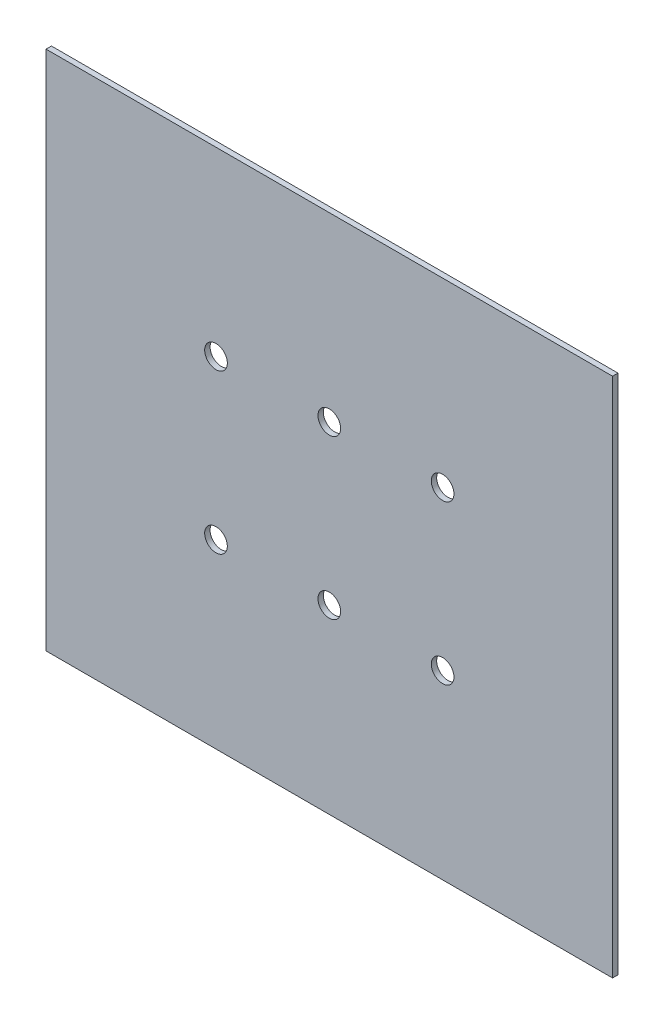
ISO-10303-21;
HEADER;
FILE_DESCRIPTION(('STEP AP214'),'2;1');
FILE_NAME('part.step','',(''),(''),'','','');
FILE_SCHEMA(('AUTOMOTIVE_DESIGN { 1 0 10303 214 1 1 1 1 }'));
ENDSEC;
DATA;
#1=APPLICATION_CONTEXT('core data for automotive mechanical design processes');
#2=APPLICATION_PROTOCOL_DEFINITION('international standard','automotive_design',2000,#1);
#3=PRODUCT_CONTEXT('',#1,'mechanical');
#4=PRODUCT('Part','Part','',(#3));
#5=PRODUCT_RELATED_PRODUCT_CATEGORY('part','',(#4));
#6=PRODUCT_DEFINITION_FORMATION('','',#4);
#7=PRODUCT_DEFINITION_CONTEXT('part definition',#1,'design');
#8=PRODUCT_DEFINITION('design','',#6,#7);
#9=PRODUCT_DEFINITION_SHAPE('','',#8);
#10=(LENGTH_UNIT() NAMED_UNIT(*) SI_UNIT(.MILLI.,.METRE.));
#11=(NAMED_UNIT(*) PLANE_ANGLE_UNIT() SI_UNIT($,.RADIAN.));
#12=(NAMED_UNIT(*) SI_UNIT($,.STERADIAN.) SOLID_ANGLE_UNIT());
#13=UNCERTAINTY_MEASURE_WITH_UNIT(LENGTH_MEASURE(1.E-05),#10,'distance_accuracy_value','');
#14=(GEOMETRIC_REPRESENTATION_CONTEXT(3) GLOBAL_UNCERTAINTY_ASSIGNED_CONTEXT((#13)) GLOBAL_UNIT_ASSIGNED_CONTEXT((#10,
#11,#12)) REPRESENTATION_CONTEXT('',''));
#15=CARTESIAN_POINT('',(0.,0.,0.));
#16=DIRECTION('',(0.,0.,1.));
#17=DIRECTION('',(1.,0.,0.));
#18=AXIS2_PLACEMENT_3D('',#15,#16,#17);
#19=CARTESIAN_POINT('',(0.,0.,4.7625));
#20=DIRECTION('',(0.,0.,1.));
#21=DIRECTION('',(1.,0.,0.));
#22=AXIS2_PLACEMENT_3D('',#19,#20,#21);
#23=PLANE('',#22);
#24=CARTESIAN_POINT('',(-100.,140.,4.7625));
#25=DIRECTION('',(0.,0.,1.));
#26=DIRECTION('',(1.,0.,0.));
#27=AXIS2_PLACEMENT_3D('',#24,#25,#26);
#28=CIRCLE('',#27,10.);
#29=CARTESIAN_POINT('',(-110.,140.,4.7625));
#30=VERTEX_POINT('',#29);
#31=EDGE_CURVE('E159',#30,#30,#28,.T.);
#32=ORIENTED_EDGE('',*,*,#31,.F.);
#33=EDGE_LOOP('',(#32));
#34=FACE_BOUND('',#33,.T.);
#35=CARTESIAN_POINT('',(-200.,0.,4.7625));
#36=DIRECTION('',(0.,0.,1.));
#37=DIRECTION('',(1.,0.,0.));
#38=AXIS2_PLACEMENT_3D('',#35,#36,#37);
#39=CIRCLE('',#38,10.);
#40=CARTESIAN_POINT('',(-210.,0.,4.7625));
#41=VERTEX_POINT('',#40);
#42=EDGE_CURVE('E143',#41,#41,#39,.T.);
#43=ORIENTED_EDGE('',*,*,#42,.F.);
#44=EDGE_LOOP('',(#43));
#45=FACE_BOUND('',#44,.T.);
#46=CARTESIAN_POINT('',(0.,0.,4.7625));
#47=DIRECTION('',(0.,0.,1.));
#48=DIRECTION('',(1.,0.,0.));
#49=AXIS2_PLACEMENT_3D('',#46,#47,#48);
#50=CIRCLE('',#49,10.);
#51=CARTESIAN_POINT('',(-10.,0.,4.7625));
#52=VERTEX_POINT('',#51);
#53=EDGE_CURVE('E111',#52,#52,#50,.T.);
#54=ORIENTED_EDGE('',*,*,#53,.F.);
#55=EDGE_LOOP('',(#54));
#56=FACE_BOUND('',#55,.T.);
#57=DIRECTION('',(0.,1.,0.));
#58=VECTOR('',#57,1.);
#59=CARTESIAN_POINT('',(150.,300.,4.7625));
#60=LINE('',#59,#58);
#61=CARTESIAN_POINT('',(150.,-160.,4.7625));
#62=VERTEX_POINT('',#61);
#63=CARTESIAN_POINT('',(150.,300.,4.7625));
#64=VERTEX_POINT('',#63);
#65=EDGE_CURVE('E90',#62,#64,#60,.T.);
#66=ORIENTED_EDGE('',*,*,#65,.T.);
#67=DIRECTION('',(-1.,0.,0.));
#68=VECTOR('',#67,1.);
#69=CARTESIAN_POINT('',(-350.,300.,4.7625));
#70=LINE('',#69,#68);
#71=CARTESIAN_POINT('',(-350.,300.,4.7625));
#72=VERTEX_POINT('',#71);
#73=EDGE_CURVE('E85',#64,#72,#70,.T.);
#74=ORIENTED_EDGE('',*,*,#73,.T.);
#75=DIRECTION('',(0.,-1.,0.));
#76=VECTOR('',#75,1.);
#77=CARTESIAN_POINT('',(-350.,300.,4.7625));
#78=LINE('',#77,#76);
#79=CARTESIAN_POINT('',(-350.,-160.,4.7625));
#80=VERTEX_POINT('',#79);
#81=EDGE_CURVE('E88',#72,#80,#78,.T.);
#82=ORIENTED_EDGE('',*,*,#81,.T.);
#83=DIRECTION('',(1.,0.,0.));
#84=VECTOR('',#83,1.);
#85=CARTESIAN_POINT('',(-350.,-160.,4.7625));
#86=LINE('',#85,#84);
#87=EDGE_CURVE('E55',#80,#62,#86,.T.);
#88=ORIENTED_EDGE('',*,*,#87,.T.);
#89=EDGE_LOOP('',(#66,#74,#82,#88));
#90=FACE_BOUND('',#89,.T.);
#91=CARTESIAN_POINT('',(-100.,0.,4.7625));
#92=DIRECTION('',(0.,0.,1.));
#93=DIRECTION('',(1.,0.,0.));
#94=AXIS2_PLACEMENT_3D('',#91,#92,#93);
#95=CIRCLE('',#94,9.99999999999999);
#96=CARTESIAN_POINT('',(-110.,0.,4.7625));
#97=VERTEX_POINT('',#96);
#98=EDGE_CURVE('E135',#97,#97,#95,.T.);
#99=ORIENTED_EDGE('',*,*,#98,.F.);
#100=EDGE_LOOP('',(#99));
#101=FACE_BOUND('',#100,.T.);
#102=CARTESIAN_POINT('',(-200.,140.,4.7625));
#103=DIRECTION('',(0.,0.,1.));
#104=DIRECTION('',(1.,0.,0.));
#105=AXIS2_PLACEMENT_3D('',#102,#103,#104);
#106=CIRCLE('',#105,10.);
#107=CARTESIAN_POINT('',(-210.,140.,4.7625));
#108=VERTEX_POINT('',#107);
#109=EDGE_CURVE('E151',#108,#108,#106,.T.);
#110=ORIENTED_EDGE('',*,*,#109,.F.);
#111=EDGE_LOOP('',(#110));
#112=FACE_BOUND('',#111,.T.);
#113=CARTESIAN_POINT('',(0.,140.,4.7625));
#114=DIRECTION('',(0.,0.,1.));
#115=DIRECTION('',(1.,0.,0.));
#116=AXIS2_PLACEMENT_3D('',#113,#114,#115);
#117=CIRCLE('',#116,10.);
#118=CARTESIAN_POINT('',(-10.,140.,4.7625));
#119=VERTEX_POINT('',#118);
#120=EDGE_CURVE('E167',#119,#119,#117,.T.);
#121=ORIENTED_EDGE('',*,*,#120,.F.);
#122=EDGE_LOOP('',(#121));
#123=FACE_BOUND('',#122,.T.);
#124=ADVANCED_FACE('F37',(#34,#45,#56,#90,#101,#112,#123),#23,.T.);
#125=CARTESIAN_POINT('',(0.,0.,0.));
#126=DIRECTION('',(0.,0.,1.));
#127=DIRECTION('',(1.,0.,0.));
#128=AXIS2_PLACEMENT_3D('',#125,#126,#127);
#129=PLANE('',#128);
#130=DIRECTION('',(0.,1.,0.));
#131=VECTOR('',#130,1.);
#132=CARTESIAN_POINT('',(150.,300.,0.));
#133=LINE('',#132,#131);
#134=CARTESIAN_POINT('',(150.,-160.,0.));
#135=VERTEX_POINT('',#134);
#136=CARTESIAN_POINT('',(150.,300.,0.));
#137=VERTEX_POINT('',#136);
#138=EDGE_CURVE('E107',#135,#137,#133,.T.);
#139=ORIENTED_EDGE('',*,*,#138,.F.);
#140=DIRECTION('',(1.,0.,0.));
#141=VECTOR('',#140,1.);
#142=CARTESIAN_POINT('',(-350.,-160.,0.));
#143=LINE('',#142,#141);
#144=CARTESIAN_POINT('',(-350.,-160.,0.));
#145=VERTEX_POINT('',#144);
#146=EDGE_CURVE('E78',#145,#135,#143,.T.);
#147=ORIENTED_EDGE('',*,*,#146,.F.);
#148=DIRECTION('',(0.,-1.,0.));
#149=VECTOR('',#148,1.);
#150=CARTESIAN_POINT('',(-350.,300.,0.));
#151=LINE('',#150,#149);
#152=CARTESIAN_POINT('',(-350.,300.,0.));
#153=VERTEX_POINT('',#152);
#154=EDGE_CURVE('E72',#153,#145,#151,.T.);
#155=ORIENTED_EDGE('',*,*,#154,.F.);
#156=DIRECTION('',(-1.,0.,0.));
#157=VECTOR('',#156,1.);
#158=CARTESIAN_POINT('',(-350.,300.,0.));
#159=LINE('',#158,#157);
#160=EDGE_CURVE('E95',#137,#153,#159,.T.);
#161=ORIENTED_EDGE('',*,*,#160,.F.);
#162=EDGE_LOOP('',(#139,#147,#155,#161));
#163=FACE_BOUND('',#162,.T.);
#164=CARTESIAN_POINT('',(0.,0.,0.));
#165=DIRECTION('',(0.,0.,1.));
#166=DIRECTION('',(1.,0.,0.));
#167=AXIS2_PLACEMENT_3D('',#164,#165,#166);
#168=CIRCLE('',#167,10.);
#169=CARTESIAN_POINT('',(-10.,0.,0.));
#170=VERTEX_POINT('',#169);
#171=EDGE_CURVE('E131',#170,#170,#168,.T.);
#172=ORIENTED_EDGE('',*,*,#171,.T.);
#173=EDGE_LOOP('',(#172));
#174=FACE_BOUND('',#173,.T.);
#175=CARTESIAN_POINT('',(-100.,0.,0.));
#176=DIRECTION('',(0.,0.,1.));
#177=DIRECTION('',(1.,0.,0.));
#178=AXIS2_PLACEMENT_3D('',#175,#176,#177);
#179=CIRCLE('',#178,9.99999999999999);
#180=CARTESIAN_POINT('',(-110.,0.,0.));
#181=VERTEX_POINT('',#180);
#182=EDGE_CURVE('E139',#181,#181,#179,.T.);
#183=ORIENTED_EDGE('',*,*,#182,.T.);
#184=EDGE_LOOP('',(#183));
#185=FACE_BOUND('',#184,.T.);
#186=CARTESIAN_POINT('',(-200.,0.,0.));
#187=DIRECTION('',(0.,0.,1.));
#188=DIRECTION('',(1.,0.,0.));
#189=AXIS2_PLACEMENT_3D('',#186,#187,#188);
#190=CIRCLE('',#189,10.);
#191=CARTESIAN_POINT('',(-210.,0.,0.));
#192=VERTEX_POINT('',#191);
#193=EDGE_CURVE('E147',#192,#192,#190,.T.);
#194=ORIENTED_EDGE('',*,*,#193,.T.);
#195=EDGE_LOOP('',(#194));
#196=FACE_BOUND('',#195,.T.);
#197=CARTESIAN_POINT('',(-200.,140.,0.));
#198=DIRECTION('',(0.,0.,1.));
#199=DIRECTION('',(1.,0.,0.));
#200=AXIS2_PLACEMENT_3D('',#197,#198,#199);
#201=CIRCLE('',#200,10.);
#202=CARTESIAN_POINT('',(-210.,140.,0.));
#203=VERTEX_POINT('',#202);
#204=EDGE_CURVE('E155',#203,#203,#201,.T.);
#205=ORIENTED_EDGE('',*,*,#204,.T.);
#206=EDGE_LOOP('',(#205));
#207=FACE_BOUND('',#206,.T.);
#208=CARTESIAN_POINT('',(-100.,140.,0.));
#209=DIRECTION('',(0.,0.,1.));
#210=DIRECTION('',(1.,0.,0.));
#211=AXIS2_PLACEMENT_3D('',#208,#209,#210);
#212=CIRCLE('',#211,10.);
#213=CARTESIAN_POINT('',(-110.,140.,0.));
#214=VERTEX_POINT('',#213);
#215=EDGE_CURVE('E163',#214,#214,#212,.T.);
#216=ORIENTED_EDGE('',*,*,#215,.T.);
#217=EDGE_LOOP('',(#216));
#218=FACE_BOUND('',#217,.T.);
#219=CARTESIAN_POINT('',(0.,140.,0.));
#220=DIRECTION('',(0.,0.,1.));
#221=DIRECTION('',(1.,0.,0.));
#222=AXIS2_PLACEMENT_3D('',#219,#220,#221);
#223=CIRCLE('',#222,10.);
#224=CARTESIAN_POINT('',(-10.,140.,0.));
#225=VERTEX_POINT('',#224);
#226=EDGE_CURVE('E171',#225,#225,#223,.T.);
#227=ORIENTED_EDGE('',*,*,#226,.T.);
#228=EDGE_LOOP('',(#227));
#229=FACE_BOUND('',#228,.T.);
#230=ADVANCED_FACE('F125',(#163,#174,#185,#196,#207,#218,#229),#129,.F.);
#231=CARTESIAN_POINT('',(150.,300.,4.7625));
#232=DIRECTION('',(-1.,0.,0.));
#233=DIRECTION('',(0.,-1.,0.));
#234=AXIS2_PLACEMENT_3D('',#231,#232,#233);
#235=PLANE('',#234);
#236=ORIENTED_EDGE('',*,*,#138,.T.);
#237=DIRECTION('',(0.,0.,-1.));
#238=VECTOR('',#237,1.);
#239=CARTESIAN_POINT('',(150.,300.,4.7625));
#240=LINE('',#239,#238);
#241=EDGE_CURVE('E11',#64,#137,#240,.T.);
#242=ORIENTED_EDGE('',*,*,#241,.F.);
#243=ORIENTED_EDGE('',*,*,#65,.F.);
#244=DIRECTION('',(0.,0.,-1.));
#245=VECTOR('',#244,1.);
#246=CARTESIAN_POINT('',(150.,-160.,4.7625));
#247=LINE('',#246,#245);
#248=EDGE_CURVE('E103',#62,#135,#247,.T.);
#249=ORIENTED_EDGE('',*,*,#248,.T.);
#250=EDGE_LOOP('',(#236,#242,#243,#249));
#251=FACE_BOUND('',#250,.T.);
#252=ADVANCED_FACE('F39',(#251),#235,.F.);
#253=CARTESIAN_POINT('',(-350.,300.,4.7625));
#254=DIRECTION('',(0.,-1.,0.));
#255=DIRECTION('',(0.,0.,-1.));
#256=AXIS2_PLACEMENT_3D('',#253,#254,#255);
#257=PLANE('',#256);
#258=ORIENTED_EDGE('',*,*,#160,.T.);
#259=DIRECTION('',(0.,0.,-1.));
#260=VECTOR('',#259,1.);
#261=CARTESIAN_POINT('',(-350.,300.,4.7625));
#262=LINE('',#261,#260);
#263=EDGE_CURVE('E47',#72,#153,#262,.T.);
#264=ORIENTED_EDGE('',*,*,#263,.F.);
#265=ORIENTED_EDGE('',*,*,#73,.F.);
#266=ORIENTED_EDGE('',*,*,#241,.T.);
#267=EDGE_LOOP('',(#258,#264,#265,#266));
#268=FACE_BOUND('',#267,.T.);
#269=ADVANCED_FACE('F94',(#268),#257,.F.);
#270=CARTESIAN_POINT('',(-350.,300.,4.7625));
#271=DIRECTION('',(1.,0.,0.));
#272=DIRECTION('',(0.,0.,-1.));
#273=AXIS2_PLACEMENT_3D('',#270,#271,#272);
#274=PLANE('',#273);
#275=ORIENTED_EDGE('',*,*,#154,.T.);
#276=DIRECTION('',(0.,0.,-1.));
#277=VECTOR('',#276,1.);
#278=CARTESIAN_POINT('',(-350.,-160.,4.7625));
#279=LINE('',#278,#277);
#280=EDGE_CURVE('E97',#80,#145,#279,.T.);
#281=ORIENTED_EDGE('',*,*,#280,.F.);
#282=ORIENTED_EDGE('',*,*,#81,.F.);
#283=ORIENTED_EDGE('',*,*,#263,.T.);
#284=EDGE_LOOP('',(#275,#281,#282,#283));
#285=FACE_BOUND('',#284,.T.);
#286=ADVANCED_FACE('F98',(#285),#274,.F.);
#287=CARTESIAN_POINT('',(-350.,-160.,4.7625));
#288=DIRECTION('',(0.,1.,0.));
#289=DIRECTION('',(0.,0.,1.));
#290=AXIS2_PLACEMENT_3D('',#287,#288,#289);
#291=PLANE('',#290);
#292=ORIENTED_EDGE('',*,*,#146,.T.);
#293=ORIENTED_EDGE('',*,*,#248,.F.);
#294=ORIENTED_EDGE('',*,*,#87,.F.);
#295=ORIENTED_EDGE('',*,*,#280,.T.);
#296=EDGE_LOOP('',(#292,#293,#294,#295));
#297=FACE_BOUND('',#296,.T.);
#298=ADVANCED_FACE('F122',(#297),#291,.F.);
#299=CARTESIAN_POINT('',(0.,0.,4.7625));
#300=DIRECTION('',(0.,0.,-1.));
#301=DIRECTION('',(-1.,0.,0.));
#302=AXIS2_PLACEMENT_3D('',#299,#300,#301);
#303=CYLINDRICAL_SURFACE('',#302,10.);
#304=CARTESIAN_POINT('',(-10.,0.,4.7625));
#305=CARTESIAN_POINT('',(-10.,0.,4.712890625));
#306=CARTESIAN_POINT('',(-10.,0.,4.66328125));
#307=CARTESIAN_POINT('',(-10.,0.,4.5640625));
#308=CARTESIAN_POINT('',(-10.,0.,4.514453125));
#309=CARTESIAN_POINT('',(-10.,0.,4.415234375));
#310=CARTESIAN_POINT('',(-10.,0.,4.365625));
#311=CARTESIAN_POINT('',(-10.,0.,4.26640625));
#312=CARTESIAN_POINT('',(-10.,0.,4.216796875));
#313=CARTESIAN_POINT('',(-10.,0.,4.117578125));
#314=CARTESIAN_POINT('',(-10.,0.,4.06796875));
#315=CARTESIAN_POINT('',(-10.,0.,3.96875));
#316=CARTESIAN_POINT('',(-10.,0.,3.919140625));
#317=CARTESIAN_POINT('',(-10.,0.,3.819921875));
#318=CARTESIAN_POINT('',(-10.,0.,3.7703125));
#319=CARTESIAN_POINT('',(-10.,0.,3.67109375));
#320=CARTESIAN_POINT('',(-10.,0.,3.621484375));
#321=CARTESIAN_POINT('',(-10.,0.,3.522265625));
#322=CARTESIAN_POINT('',(-10.,0.,3.47265625));
#323=CARTESIAN_POINT('',(-10.,0.,3.3734375));
#324=CARTESIAN_POINT('',(-10.,0.,3.323828125));
#325=CARTESIAN_POINT('',(-10.,0.,3.224609375));
#326=CARTESIAN_POINT('',(-10.,0.,3.175));
#327=CARTESIAN_POINT('',(-10.,0.,3.07578125));
#328=CARTESIAN_POINT('',(-10.,0.,3.026171875));
#329=CARTESIAN_POINT('',(-10.,0.,2.926953125));
#330=CARTESIAN_POINT('',(-10.,0.,2.87734375));
#331=CARTESIAN_POINT('',(-10.,0.,2.778125));
#332=CARTESIAN_POINT('',(-10.,0.,2.728515625));
#333=CARTESIAN_POINT('',(-10.,0.,2.629296875));
#334=CARTESIAN_POINT('',(-10.,0.,2.5796875));
#335=CARTESIAN_POINT('',(-10.,0.,2.48046875));
#336=CARTESIAN_POINT('',(-10.,0.,2.430859375));
#337=CARTESIAN_POINT('',(-10.,0.,2.331640625));
#338=CARTESIAN_POINT('',(-10.,0.,2.28203125));
#339=CARTESIAN_POINT('',(-10.,0.,2.1828125));
#340=CARTESIAN_POINT('',(-10.,0.,2.133203125));
#341=CARTESIAN_POINT('',(-10.,0.,2.033984375));
#342=CARTESIAN_POINT('',(-10.,0.,1.984375));
#343=CARTESIAN_POINT('',(-10.,0.,1.88515625));
#344=CARTESIAN_POINT('',(-10.,0.,1.835546875));
#345=CARTESIAN_POINT('',(-10.,0.,1.736328125));
#346=CARTESIAN_POINT('',(-10.,0.,1.68671875));
#347=CARTESIAN_POINT('',(-10.,0.,1.5875));
#348=CARTESIAN_POINT('',(-10.,0.,1.537890625));
#349=CARTESIAN_POINT('',(-10.,0.,1.438671875));
#350=CARTESIAN_POINT('',(-10.,0.,1.3890625));
#351=CARTESIAN_POINT('',(-10.,0.,1.28984375));
#352=CARTESIAN_POINT('',(-10.,0.,1.240234375));
#353=CARTESIAN_POINT('',(-10.,0.,1.141015625));
#354=CARTESIAN_POINT('',(-10.,0.,1.09140625));
#355=CARTESIAN_POINT('',(-10.,0.,0.9921875));
#356=CARTESIAN_POINT('',(-10.,0.,0.942578125));
#357=CARTESIAN_POINT('',(-10.,0.,0.843359375));
#358=CARTESIAN_POINT('',(-10.,0.,0.79375));
#359=CARTESIAN_POINT('',(-10.,0.,0.69453125));
#360=CARTESIAN_POINT('',(-10.,0.,0.644921875));
#361=CARTESIAN_POINT('',(-10.,0.,0.545703125));
#362=CARTESIAN_POINT('',(-10.,0.,0.49609375));
#363=CARTESIAN_POINT('',(-10.,0.,0.396875));
#364=CARTESIAN_POINT('',(-10.,0.,0.347265625));
#365=CARTESIAN_POINT('',(-10.,0.,0.248046875));
#366=CARTESIAN_POINT('',(-10.,0.,0.1984375));
#367=CARTESIAN_POINT('',(-10.,0.,0.09921875));
#368=CARTESIAN_POINT('',(-10.,0.,0.049609375));
#369=CARTESIAN_POINT('',(-10.,0.,0.));
#370=B_SPLINE_CURVE_WITH_KNOTS('',3,(#304,#305,#306,#307,#308,#309,#310,#311,#312,#313,#314,
#315,#316,#317,#318,#319,#320,#321,#322,#323,#324,#325,#326,#327,#328,#329,#330,#331,#332,#333,
#334,#335,#336,#337,#338,#339,#340,#341,#342,#343,#344,#345,#346,#347,#348,#349,#350,#351,#352,
#353,#354,#355,#356,#357,#358,#359,#360,#361,#362,#363,#364,#365,#366,#367,#368,#369),
.UNSPECIFIED.,.F.,.F.,(4,2,2,2,2,2,2,2,2,2,2,2,2,2,2,2,2,2,2,2,2,2,2,2,2,2,2,2,2,2,2,2,4),(0.,
0.148828124999999,0.297656249999999,0.446484374999999,0.595312499999999,0.744140625,0.89296875,
1.041796875,1.190625,1.339453125,1.48828125,1.637109375,1.7859375,1.934765625,2.08359375,
2.232421875,2.38125,2.530078125,2.67890625,2.827734375,2.9765625,3.125390625,3.27421875,
3.423046875,3.571875,3.720703125,3.86953125,4.018359375,4.1671875,4.316015625,4.46484375,
4.613671875,4.7625),.UNSPECIFIED.);
#371=EDGE_CURVE('BSEAM193',#52,#170,#370,.T.);
#372=ORIENTED_EDGE('',*,*,#53,.T.);
#373=ORIENTED_EDGE('',*,*,#171,.F.);
#374=ORIENTED_EDGE('',*,*,#371,.T.);
#375=ORIENTED_EDGE('',*,*,#371,.F.);
#376=EDGE_LOOP('',(#372,#374,#373,#375));
#377=FACE_BOUND('',#376,.T.);
#378=ADVANCED_FACE('F193',(#377),#303,.F.);
#379=CARTESIAN_POINT('',(-100.,0.,4.7625));
#380=DIRECTION('',(0.,0.,-1.));
#381=DIRECTION('',(-1.,0.,0.));
#382=AXIS2_PLACEMENT_3D('',#379,#380,#381);
#383=CYLINDRICAL_SURFACE('',#382,9.99999999999999);
#384=CARTESIAN_POINT('',(-110.,0.,4.7625));
#385=CARTESIAN_POINT('',(-110.,0.,4.712890625));
#386=CARTESIAN_POINT('',(-110.,0.,4.66328125));
#387=CARTESIAN_POINT('',(-110.,0.,4.5640625));
#388=CARTESIAN_POINT('',(-110.,0.,4.514453125));
#389=CARTESIAN_POINT('',(-110.,0.,4.415234375));
#390=CARTESIAN_POINT('',(-110.,0.,4.365625));
#391=CARTESIAN_POINT('',(-110.,0.,4.26640625));
#392=CARTESIAN_POINT('',(-110.,0.,4.216796875));
#393=CARTESIAN_POINT('',(-110.,0.,4.117578125));
#394=CARTESIAN_POINT('',(-110.,0.,4.06796875));
#395=CARTESIAN_POINT('',(-110.,0.,3.96875));
#396=CARTESIAN_POINT('',(-110.,0.,3.919140625));
#397=CARTESIAN_POINT('',(-110.,0.,3.819921875));
#398=CARTESIAN_POINT('',(-110.,0.,3.7703125));
#399=CARTESIAN_POINT('',(-110.,0.,3.67109375));
#400=CARTESIAN_POINT('',(-110.,0.,3.621484375));
#401=CARTESIAN_POINT('',(-110.,0.,3.522265625));
#402=CARTESIAN_POINT('',(-110.,0.,3.47265625));
#403=CARTESIAN_POINT('',(-110.,0.,3.3734375));
#404=CARTESIAN_POINT('',(-110.,0.,3.323828125));
#405=CARTESIAN_POINT('',(-110.,0.,3.224609375));
#406=CARTESIAN_POINT('',(-110.,0.,3.175));
#407=CARTESIAN_POINT('',(-110.,0.,3.07578125));
#408=CARTESIAN_POINT('',(-110.,0.,3.026171875));
#409=CARTESIAN_POINT('',(-110.,0.,2.926953125));
#410=CARTESIAN_POINT('',(-110.,0.,2.87734375));
#411=CARTESIAN_POINT('',(-110.,0.,2.778125));
#412=CARTESIAN_POINT('',(-110.,0.,2.728515625));
#413=CARTESIAN_POINT('',(-110.,0.,2.629296875));
#414=CARTESIAN_POINT('',(-110.,0.,2.5796875));
#415=CARTESIAN_POINT('',(-110.,0.,2.48046875));
#416=CARTESIAN_POINT('',(-110.,0.,2.430859375));
#417=CARTESIAN_POINT('',(-110.,0.,2.331640625));
#418=CARTESIAN_POINT('',(-110.,0.,2.28203125));
#419=CARTESIAN_POINT('',(-110.,0.,2.1828125));
#420=CARTESIAN_POINT('',(-110.,0.,2.133203125));
#421=CARTESIAN_POINT('',(-110.,0.,2.033984375));
#422=CARTESIAN_POINT('',(-110.,0.,1.984375));
#423=CARTESIAN_POINT('',(-110.,0.,1.88515625));
#424=CARTESIAN_POINT('',(-110.,0.,1.835546875));
#425=CARTESIAN_POINT('',(-110.,0.,1.736328125));
#426=CARTESIAN_POINT('',(-110.,0.,1.68671875));
#427=CARTESIAN_POINT('',(-110.,0.,1.5875));
#428=CARTESIAN_POINT('',(-110.,0.,1.537890625));
#429=CARTESIAN_POINT('',(-110.,0.,1.438671875));
#430=CARTESIAN_POINT('',(-110.,0.,1.3890625));
#431=CARTESIAN_POINT('',(-110.,0.,1.28984375));
#432=CARTESIAN_POINT('',(-110.,0.,1.240234375));
#433=CARTESIAN_POINT('',(-110.,0.,1.141015625));
#434=CARTESIAN_POINT('',(-110.,0.,1.09140625));
#435=CARTESIAN_POINT('',(-110.,0.,0.9921875));
#436=CARTESIAN_POINT('',(-110.,0.,0.942578125));
#437=CARTESIAN_POINT('',(-110.,0.,0.843359375));
#438=CARTESIAN_POINT('',(-110.,0.,0.79375));
#439=CARTESIAN_POINT('',(-110.,0.,0.69453125));
#440=CARTESIAN_POINT('',(-110.,0.,0.644921875));
#441=CARTESIAN_POINT('',(-110.,0.,0.545703125));
#442=CARTESIAN_POINT('',(-110.,0.,0.49609375));
#443=CARTESIAN_POINT('',(-110.,0.,0.396875));
#444=CARTESIAN_POINT('',(-110.,0.,0.347265625));
#445=CARTESIAN_POINT('',(-110.,0.,0.248046875));
#446=CARTESIAN_POINT('',(-110.,0.,0.1984375));
#447=CARTESIAN_POINT('',(-110.,0.,0.09921875));
#448=CARTESIAN_POINT('',(-110.,0.,0.049609375));
#449=CARTESIAN_POINT('',(-110.,0.,0.));
#450=B_SPLINE_CURVE_WITH_KNOTS('',3,(#384,#385,#386,#387,#388,#389,#390,#391,#392,#393,#394,
#395,#396,#397,#398,#399,#400,#401,#402,#403,#404,#405,#406,#407,#408,#409,#410,#411,#412,#413,
#414,#415,#416,#417,#418,#419,#420,#421,#422,#423,#424,#425,#426,#427,#428,#429,#430,#431,#432,
#433,#434,#435,#436,#437,#438,#439,#440,#441,#442,#443,#444,#445,#446,#447,#448,#449),
.UNSPECIFIED.,.F.,.F.,(4,2,2,2,2,2,2,2,2,2,2,2,2,2,2,2,2,2,2,2,2,2,2,2,2,2,2,2,2,2,2,2,4),(0.,
0.148828124999999,0.297656249999999,0.446484374999999,0.595312499999999,0.744140625,0.89296875,
1.041796875,1.190625,1.339453125,1.48828125,1.637109375,1.7859375,1.934765625,2.08359375,
2.232421875,2.38125,2.530078125,2.67890625,2.827734375,2.9765625,3.125390625,3.27421875,
3.423046875,3.571875,3.720703125,3.86953125,4.018359375,4.1671875,4.316015625,4.46484375,
4.613671875,4.7625),.UNSPECIFIED.);
#451=EDGE_CURVE('BSEAM248',#97,#181,#450,.T.);
#452=ORIENTED_EDGE('',*,*,#98,.T.);
#453=ORIENTED_EDGE('',*,*,#182,.F.);
#454=ORIENTED_EDGE('',*,*,#451,.T.);
#455=ORIENTED_EDGE('',*,*,#451,.F.);
#456=EDGE_LOOP('',(#452,#454,#453,#455));
#457=FACE_BOUND('',#456,.T.);
#458=ADVANCED_FACE('F248',(#457),#383,.F.);
#459=CARTESIAN_POINT('',(-200.,0.,4.7625));
#460=DIRECTION('',(0.,0.,-1.));
#461=DIRECTION('',(-1.,0.,0.));
#462=AXIS2_PLACEMENT_3D('',#459,#460,#461);
#463=CYLINDRICAL_SURFACE('',#462,10.);
#464=CARTESIAN_POINT('',(-210.,0.,4.7625));
#465=CARTESIAN_POINT('',(-210.,0.,4.712890625));
#466=CARTESIAN_POINT('',(-210.,0.,4.66328125));
#467=CARTESIAN_POINT('',(-210.,0.,4.5640625));
#468=CARTESIAN_POINT('',(-210.,0.,4.514453125));
#469=CARTESIAN_POINT('',(-210.,0.,4.415234375));
#470=CARTESIAN_POINT('',(-210.,0.,4.365625));
#471=CARTESIAN_POINT('',(-210.,0.,4.26640625));
#472=CARTESIAN_POINT('',(-210.,0.,4.216796875));
#473=CARTESIAN_POINT('',(-210.,0.,4.117578125));
#474=CARTESIAN_POINT('',(-210.,0.,4.06796875));
#475=CARTESIAN_POINT('',(-210.,0.,3.96875));
#476=CARTESIAN_POINT('',(-210.,0.,3.919140625));
#477=CARTESIAN_POINT('',(-210.,0.,3.819921875));
#478=CARTESIAN_POINT('',(-210.,0.,3.7703125));
#479=CARTESIAN_POINT('',(-210.,0.,3.67109375));
#480=CARTESIAN_POINT('',(-210.,0.,3.621484375));
#481=CARTESIAN_POINT('',(-210.,0.,3.522265625));
#482=CARTESIAN_POINT('',(-210.,0.,3.47265625));
#483=CARTESIAN_POINT('',(-210.,0.,3.3734375));
#484=CARTESIAN_POINT('',(-210.,0.,3.323828125));
#485=CARTESIAN_POINT('',(-210.,0.,3.224609375));
#486=CARTESIAN_POINT('',(-210.,0.,3.175));
#487=CARTESIAN_POINT('',(-210.,0.,3.07578125));
#488=CARTESIAN_POINT('',(-210.,0.,3.026171875));
#489=CARTESIAN_POINT('',(-210.,0.,2.926953125));
#490=CARTESIAN_POINT('',(-210.,0.,2.87734375));
#491=CARTESIAN_POINT('',(-210.,0.,2.778125));
#492=CARTESIAN_POINT('',(-210.,0.,2.728515625));
#493=CARTESIAN_POINT('',(-210.,0.,2.629296875));
#494=CARTESIAN_POINT('',(-210.,0.,2.5796875));
#495=CARTESIAN_POINT('',(-210.,0.,2.48046875));
#496=CARTESIAN_POINT('',(-210.,0.,2.430859375));
#497=CARTESIAN_POINT('',(-210.,0.,2.331640625));
#498=CARTESIAN_POINT('',(-210.,0.,2.28203125));
#499=CARTESIAN_POINT('',(-210.,0.,2.1828125));
#500=CARTESIAN_POINT('',(-210.,0.,2.133203125));
#501=CARTESIAN_POINT('',(-210.,0.,2.033984375));
#502=CARTESIAN_POINT('',(-210.,0.,1.984375));
#503=CARTESIAN_POINT('',(-210.,0.,1.88515625));
#504=CARTESIAN_POINT('',(-210.,0.,1.835546875));
#505=CARTESIAN_POINT('',(-210.,0.,1.736328125));
#506=CARTESIAN_POINT('',(-210.,0.,1.68671875));
#507=CARTESIAN_POINT('',(-210.,0.,1.5875));
#508=CARTESIAN_POINT('',(-210.,0.,1.537890625));
#509=CARTESIAN_POINT('',(-210.,0.,1.438671875));
#510=CARTESIAN_POINT('',(-210.,0.,1.3890625));
#511=CARTESIAN_POINT('',(-210.,0.,1.28984375));
#512=CARTESIAN_POINT('',(-210.,0.,1.240234375));
#513=CARTESIAN_POINT('',(-210.,0.,1.141015625));
#514=CARTESIAN_POINT('',(-210.,0.,1.09140625));
#515=CARTESIAN_POINT('',(-210.,0.,0.9921875));
#516=CARTESIAN_POINT('',(-210.,0.,0.942578125));
#517=CARTESIAN_POINT('',(-210.,0.,0.843359375));
#518=CARTESIAN_POINT('',(-210.,0.,0.79375));
#519=CARTESIAN_POINT('',(-210.,0.,0.69453125));
#520=CARTESIAN_POINT('',(-210.,0.,0.644921875));
#521=CARTESIAN_POINT('',(-210.,0.,0.545703125));
#522=CARTESIAN_POINT('',(-210.,0.,0.49609375));
#523=CARTESIAN_POINT('',(-210.,0.,0.396875));
#524=CARTESIAN_POINT('',(-210.,0.,0.347265625));
#525=CARTESIAN_POINT('',(-210.,0.,0.248046875));
#526=CARTESIAN_POINT('',(-210.,0.,0.1984375));
#527=CARTESIAN_POINT('',(-210.,0.,0.09921875));
#528=CARTESIAN_POINT('',(-210.,0.,0.049609375));
#529=CARTESIAN_POINT('',(-210.,0.,0.));
#530=B_SPLINE_CURVE_WITH_KNOTS('',3,(#464,#465,#466,#467,#468,#469,#470,#471,#472,#473,#474,
#475,#476,#477,#478,#479,#480,#481,#482,#483,#484,#485,#486,#487,#488,#489,#490,#491,#492,#493,
#494,#495,#496,#497,#498,#499,#500,#501,#502,#503,#504,#505,#506,#507,#508,#509,#510,#511,#512,
#513,#514,#515,#516,#517,#518,#519,#520,#521,#522,#523,#524,#525,#526,#527,#528,#529),
.UNSPECIFIED.,.F.,.F.,(4,2,2,2,2,2,2,2,2,2,2,2,2,2,2,2,2,2,2,2,2,2,2,2,2,2,2,2,2,2,2,2,4),(0.,
0.148828124999999,0.297656249999999,0.446484374999999,0.595312499999999,0.744140625,0.89296875,
1.041796875,1.190625,1.339453125,1.48828125,1.637109375,1.7859375,1.934765625,2.08359375,
2.232421875,2.38125,2.530078125,2.67890625,2.827734375,2.9765625,3.125390625,3.27421875,
3.423046875,3.571875,3.720703125,3.86953125,4.018359375,4.1671875,4.316015625,4.46484375,
4.613671875,4.7625),.UNSPECIFIED.);
#531=EDGE_CURVE('BSEAM257',#41,#192,#530,.T.);
#532=ORIENTED_EDGE('',*,*,#42,.T.);
#533=ORIENTED_EDGE('',*,*,#193,.F.);
#534=ORIENTED_EDGE('',*,*,#531,.T.);
#535=ORIENTED_EDGE('',*,*,#531,.F.);
#536=EDGE_LOOP('',(#532,#534,#533,#535));
#537=FACE_BOUND('',#536,.T.);
#538=ADVANCED_FACE('F257',(#537),#463,.F.);
#539=CARTESIAN_POINT('',(-200.,140.,4.7625));
#540=DIRECTION('',(0.,0.,-1.));
#541=DIRECTION('',(-1.,0.,0.));
#542=AXIS2_PLACEMENT_3D('',#539,#540,#541);
#543=CYLINDRICAL_SURFACE('',#542,10.);
#544=CARTESIAN_POINT('',(-210.,140.,4.7625));
#545=CARTESIAN_POINT('',(-210.,140.,4.712890625));
#546=CARTESIAN_POINT('',(-210.,140.,4.66328125));
#547=CARTESIAN_POINT('',(-210.,140.,4.5640625));
#548=CARTESIAN_POINT('',(-210.,140.,4.514453125));
#549=CARTESIAN_POINT('',(-210.,140.,4.415234375));
#550=CARTESIAN_POINT('',(-210.,140.,4.365625));
#551=CARTESIAN_POINT('',(-210.,140.,4.26640625));
#552=CARTESIAN_POINT('',(-210.,140.,4.216796875));
#553=CARTESIAN_POINT('',(-210.,140.,4.117578125));
#554=CARTESIAN_POINT('',(-210.,140.,4.06796875));
#555=CARTESIAN_POINT('',(-210.,140.,3.96875));
#556=CARTESIAN_POINT('',(-210.,140.,3.919140625));
#557=CARTESIAN_POINT('',(-210.,140.,3.819921875));
#558=CARTESIAN_POINT('',(-210.,140.,3.7703125));
#559=CARTESIAN_POINT('',(-210.,140.,3.67109375));
#560=CARTESIAN_POINT('',(-210.,140.,3.621484375));
#561=CARTESIAN_POINT('',(-210.,140.,3.522265625));
#562=CARTESIAN_POINT('',(-210.,140.,3.47265625));
#563=CARTESIAN_POINT('',(-210.,140.,3.3734375));
#564=CARTESIAN_POINT('',(-210.,140.,3.323828125));
#565=CARTESIAN_POINT('',(-210.,140.,3.224609375));
#566=CARTESIAN_POINT('',(-210.,140.,3.175));
#567=CARTESIAN_POINT('',(-210.,140.,3.07578125));
#568=CARTESIAN_POINT('',(-210.,140.,3.026171875));
#569=CARTESIAN_POINT('',(-210.,140.,2.926953125));
#570=CARTESIAN_POINT('',(-210.,140.,2.87734375));
#571=CARTESIAN_POINT('',(-210.,140.,2.778125));
#572=CARTESIAN_POINT('',(-210.,140.,2.728515625));
#573=CARTESIAN_POINT('',(-210.,140.,2.629296875));
#574=CARTESIAN_POINT('',(-210.,140.,2.5796875));
#575=CARTESIAN_POINT('',(-210.,140.,2.48046875));
#576=CARTESIAN_POINT('',(-210.,140.,2.430859375));
#577=CARTESIAN_POINT('',(-210.,140.,2.331640625));
#578=CARTESIAN_POINT('',(-210.,140.,2.28203125));
#579=CARTESIAN_POINT('',(-210.,140.,2.1828125));
#580=CARTESIAN_POINT('',(-210.,140.,2.133203125));
#581=CARTESIAN_POINT('',(-210.,140.,2.033984375));
#582=CARTESIAN_POINT('',(-210.,140.,1.984375));
#583=CARTESIAN_POINT('',(-210.,140.,1.88515625));
#584=CARTESIAN_POINT('',(-210.,140.,1.835546875));
#585=CARTESIAN_POINT('',(-210.,140.,1.736328125));
#586=CARTESIAN_POINT('',(-210.,140.,1.68671875));
#587=CARTESIAN_POINT('',(-210.,140.,1.5875));
#588=CARTESIAN_POINT('',(-210.,140.,1.537890625));
#589=CARTESIAN_POINT('',(-210.,140.,1.438671875));
#590=CARTESIAN_POINT('',(-210.,140.,1.3890625));
#591=CARTESIAN_POINT('',(-210.,140.,1.28984375));
#592=CARTESIAN_POINT('',(-210.,140.,1.240234375));
#593=CARTESIAN_POINT('',(-210.,140.,1.141015625));
#594=CARTESIAN_POINT('',(-210.,140.,1.09140625));
#595=CARTESIAN_POINT('',(-210.,140.,0.9921875));
#596=CARTESIAN_POINT('',(-210.,140.,0.942578125));
#597=CARTESIAN_POINT('',(-210.,140.,0.843359375));
#598=CARTESIAN_POINT('',(-210.,140.,0.79375));
#599=CARTESIAN_POINT('',(-210.,140.,0.69453125));
#600=CARTESIAN_POINT('',(-210.,140.,0.644921875));
#601=CARTESIAN_POINT('',(-210.,140.,0.545703125));
#602=CARTESIAN_POINT('',(-210.,140.,0.49609375));
#603=CARTESIAN_POINT('',(-210.,140.,0.396875));
#604=CARTESIAN_POINT('',(-210.,140.,0.347265625));
#605=CARTESIAN_POINT('',(-210.,140.,0.248046875));
#606=CARTESIAN_POINT('',(-210.,140.,0.1984375));
#607=CARTESIAN_POINT('',(-210.,140.,0.09921875));
#608=CARTESIAN_POINT('',(-210.,140.,0.049609375));
#609=CARTESIAN_POINT('',(-210.,140.,0.));
#610=B_SPLINE_CURVE_WITH_KNOTS('',3,(#544,#545,#546,#547,#548,#549,#550,#551,#552,#553,#554,
#555,#556,#557,#558,#559,#560,#561,#562,#563,#564,#565,#566,#567,#568,#569,#570,#571,#572,#573,
#574,#575,#576,#577,#578,#579,#580,#581,#582,#583,#584,#585,#586,#587,#588,#589,#590,#591,#592,
#593,#594,#595,#596,#597,#598,#599,#600,#601,#602,#603,#604,#605,#606,#607,#608,#609),
.UNSPECIFIED.,.F.,.F.,(4,2,2,2,2,2,2,2,2,2,2,2,2,2,2,2,2,2,2,2,2,2,2,2,2,2,2,2,2,2,2,2,4),(0.,
0.148828124999999,0.297656249999999,0.446484374999999,0.595312499999999,0.744140625,0.89296875,
1.041796875,1.190625,1.339453125,1.48828125,1.637109375,1.7859375,1.934765625,2.08359375,
2.232421875,2.38125,2.530078125,2.67890625,2.827734375,2.9765625,3.125390625,3.27421875,
3.423046875,3.571875,3.720703125,3.86953125,4.018359375,4.1671875,4.316015625,4.46484375,
4.613671875,4.7625),.UNSPECIFIED.);
#611=EDGE_CURVE('BSEAM266',#108,#203,#610,.T.);
#612=ORIENTED_EDGE('',*,*,#109,.T.);
#613=ORIENTED_EDGE('',*,*,#204,.F.);
#614=ORIENTED_EDGE('',*,*,#611,.T.);
#615=ORIENTED_EDGE('',*,*,#611,.F.);
#616=EDGE_LOOP('',(#612,#614,#613,#615));
#617=FACE_BOUND('',#616,.T.);
#618=ADVANCED_FACE('F266',(#617),#543,.F.);
#619=CARTESIAN_POINT('',(-100.,140.,4.7625));
#620=DIRECTION('',(0.,0.,-1.));
#621=DIRECTION('',(-1.,0.,0.));
#622=AXIS2_PLACEMENT_3D('',#619,#620,#621);
#623=CYLINDRICAL_SURFACE('',#622,10.);
#624=CARTESIAN_POINT('',(-110.,140.,4.7625));
#625=CARTESIAN_POINT('',(-110.,140.,4.712890625));
#626=CARTESIAN_POINT('',(-110.,140.,4.66328125));
#627=CARTESIAN_POINT('',(-110.,140.,4.5640625));
#628=CARTESIAN_POINT('',(-110.,140.,4.514453125));
#629=CARTESIAN_POINT('',(-110.,140.,4.415234375));
#630=CARTESIAN_POINT('',(-110.,140.,4.365625));
#631=CARTESIAN_POINT('',(-110.,140.,4.26640625));
#632=CARTESIAN_POINT('',(-110.,140.,4.216796875));
#633=CARTESIAN_POINT('',(-110.,140.,4.117578125));
#634=CARTESIAN_POINT('',(-110.,140.,4.06796875));
#635=CARTESIAN_POINT('',(-110.,140.,3.96875));
#636=CARTESIAN_POINT('',(-110.,140.,3.919140625));
#637=CARTESIAN_POINT('',(-110.,140.,3.819921875));
#638=CARTESIAN_POINT('',(-110.,140.,3.7703125));
#639=CARTESIAN_POINT('',(-110.,140.,3.67109375));
#640=CARTESIAN_POINT('',(-110.,140.,3.621484375));
#641=CARTESIAN_POINT('',(-110.,140.,3.522265625));
#642=CARTESIAN_POINT('',(-110.,140.,3.47265625));
#643=CARTESIAN_POINT('',(-110.,140.,3.3734375));
#644=CARTESIAN_POINT('',(-110.,140.,3.323828125));
#645=CARTESIAN_POINT('',(-110.,140.,3.224609375));
#646=CARTESIAN_POINT('',(-110.,140.,3.175));
#647=CARTESIAN_POINT('',(-110.,140.,3.07578125));
#648=CARTESIAN_POINT('',(-110.,140.,3.026171875));
#649=CARTESIAN_POINT('',(-110.,140.,2.926953125));
#650=CARTESIAN_POINT('',(-110.,140.,2.87734375));
#651=CARTESIAN_POINT('',(-110.,140.,2.778125));
#652=CARTESIAN_POINT('',(-110.,140.,2.728515625));
#653=CARTESIAN_POINT('',(-110.,140.,2.629296875));
#654=CARTESIAN_POINT('',(-110.,140.,2.5796875));
#655=CARTESIAN_POINT('',(-110.,140.,2.48046875));
#656=CARTESIAN_POINT('',(-110.,140.,2.430859375));
#657=CARTESIAN_POINT('',(-110.,140.,2.331640625));
#658=CARTESIAN_POINT('',(-110.,140.,2.28203125));
#659=CARTESIAN_POINT('',(-110.,140.,2.1828125));
#660=CARTESIAN_POINT('',(-110.,140.,2.133203125));
#661=CARTESIAN_POINT('',(-110.,140.,2.033984375));
#662=CARTESIAN_POINT('',(-110.,140.,1.984375));
#663=CARTESIAN_POINT('',(-110.,140.,1.88515625));
#664=CARTESIAN_POINT('',(-110.,140.,1.835546875));
#665=CARTESIAN_POINT('',(-110.,140.,1.736328125));
#666=CARTESIAN_POINT('',(-110.,140.,1.68671875));
#667=CARTESIAN_POINT('',(-110.,140.,1.5875));
#668=CARTESIAN_POINT('',(-110.,140.,1.537890625));
#669=CARTESIAN_POINT('',(-110.,140.,1.438671875));
#670=CARTESIAN_POINT('',(-110.,140.,1.3890625));
#671=CARTESIAN_POINT('',(-110.,140.,1.28984375));
#672=CARTESIAN_POINT('',(-110.,140.,1.240234375));
#673=CARTESIAN_POINT('',(-110.,140.,1.141015625));
#674=CARTESIAN_POINT('',(-110.,140.,1.09140625));
#675=CARTESIAN_POINT('',(-110.,140.,0.9921875));
#676=CARTESIAN_POINT('',(-110.,140.,0.942578125));
#677=CARTESIAN_POINT('',(-110.,140.,0.843359375));
#678=CARTESIAN_POINT('',(-110.,140.,0.79375));
#679=CARTESIAN_POINT('',(-110.,140.,0.69453125));
#680=CARTESIAN_POINT('',(-110.,140.,0.644921875));
#681=CARTESIAN_POINT('',(-110.,140.,0.545703125));
#682=CARTESIAN_POINT('',(-110.,140.,0.49609375));
#683=CARTESIAN_POINT('',(-110.,140.,0.396875));
#684=CARTESIAN_POINT('',(-110.,140.,0.347265625));
#685=CARTESIAN_POINT('',(-110.,140.,0.248046875));
#686=CARTESIAN_POINT('',(-110.,140.,0.1984375));
#687=CARTESIAN_POINT('',(-110.,140.,0.09921875));
#688=CARTESIAN_POINT('',(-110.,140.,0.049609375));
#689=CARTESIAN_POINT('',(-110.,140.,0.));
#690=B_SPLINE_CURVE_WITH_KNOTS('',3,(#624,#625,#626,#627,#628,#629,#630,#631,#632,#633,#634,
#635,#636,#637,#638,#639,#640,#641,#642,#643,#644,#645,#646,#647,#648,#649,#650,#651,#652,#653,
#654,#655,#656,#657,#658,#659,#660,#661,#662,#663,#664,#665,#666,#667,#668,#669,#670,#671,#672,
#673,#674,#675,#676,#677,#678,#679,#680,#681,#682,#683,#684,#685,#686,#687,#688,#689),
.UNSPECIFIED.,.F.,.F.,(4,2,2,2,2,2,2,2,2,2,2,2,2,2,2,2,2,2,2,2,2,2,2,2,2,2,2,2,2,2,2,2,4),(0.,
0.148828124999999,0.297656249999999,0.446484374999999,0.595312499999999,0.744140625,0.89296875,
1.041796875,1.190625,1.339453125,1.48828125,1.637109375,1.7859375,1.934765625,2.08359375,
2.232421875,2.38125,2.530078125,2.67890625,2.827734375,2.9765625,3.125390625,3.27421875,
3.423046875,3.571875,3.720703125,3.86953125,4.018359375,4.1671875,4.316015625,4.46484375,
4.613671875,4.7625),.UNSPECIFIED.);
#691=EDGE_CURVE('BSEAM276',#30,#214,#690,.T.);
#692=ORIENTED_EDGE('',*,*,#31,.T.);
#693=ORIENTED_EDGE('',*,*,#215,.F.);
#694=ORIENTED_EDGE('',*,*,#691,.T.);
#695=ORIENTED_EDGE('',*,*,#691,.F.);
#696=EDGE_LOOP('',(#692,#694,#693,#695));
#697=FACE_BOUND('',#696,.T.);
#698=ADVANCED_FACE('F276',(#697),#623,.F.);
#699=CARTESIAN_POINT('',(0.,140.,4.7625));
#700=DIRECTION('',(0.,0.,-1.));
#701=DIRECTION('',(-1.,0.,0.));
#702=AXIS2_PLACEMENT_3D('',#699,#700,#701);
#703=CYLINDRICAL_SURFACE('',#702,10.);
#704=CARTESIAN_POINT('',(-10.,140.,4.7625));
#705=CARTESIAN_POINT('',(-10.,140.,4.712890625));
#706=CARTESIAN_POINT('',(-10.,140.,4.66328125));
#707=CARTESIAN_POINT('',(-10.,140.,4.5640625));
#708=CARTESIAN_POINT('',(-10.,140.,4.514453125));
#709=CARTESIAN_POINT('',(-10.,140.,4.415234375));
#710=CARTESIAN_POINT('',(-10.,140.,4.365625));
#711=CARTESIAN_POINT('',(-10.,140.,4.26640625));
#712=CARTESIAN_POINT('',(-10.,140.,4.216796875));
#713=CARTESIAN_POINT('',(-10.,140.,4.117578125));
#714=CARTESIAN_POINT('',(-10.,140.,4.06796875));
#715=CARTESIAN_POINT('',(-10.,140.,3.96875));
#716=CARTESIAN_POINT('',(-10.,140.,3.919140625));
#717=CARTESIAN_POINT('',(-10.,140.,3.819921875));
#718=CARTESIAN_POINT('',(-10.,140.,3.7703125));
#719=CARTESIAN_POINT('',(-10.,140.,3.67109375));
#720=CARTESIAN_POINT('',(-10.,140.,3.621484375));
#721=CARTESIAN_POINT('',(-10.,140.,3.522265625));
#722=CARTESIAN_POINT('',(-10.,140.,3.47265625));
#723=CARTESIAN_POINT('',(-10.,140.,3.3734375));
#724=CARTESIAN_POINT('',(-10.,140.,3.323828125));
#725=CARTESIAN_POINT('',(-10.,140.,3.224609375));
#726=CARTESIAN_POINT('',(-10.,140.,3.175));
#727=CARTESIAN_POINT('',(-10.,140.,3.07578125));
#728=CARTESIAN_POINT('',(-10.,140.,3.026171875));
#729=CARTESIAN_POINT('',(-10.,140.,2.926953125));
#730=CARTESIAN_POINT('',(-10.,140.,2.87734375));
#731=CARTESIAN_POINT('',(-10.,140.,2.778125));
#732=CARTESIAN_POINT('',(-10.,140.,2.728515625));
#733=CARTESIAN_POINT('',(-10.,140.,2.629296875));
#734=CARTESIAN_POINT('',(-10.,140.,2.5796875));
#735=CARTESIAN_POINT('',(-10.,140.,2.48046875));
#736=CARTESIAN_POINT('',(-10.,140.,2.430859375));
#737=CARTESIAN_POINT('',(-10.,140.,2.331640625));
#738=CARTESIAN_POINT('',(-10.,140.,2.28203125));
#739=CARTESIAN_POINT('',(-10.,140.,2.1828125));
#740=CARTESIAN_POINT('',(-10.,140.,2.133203125));
#741=CARTESIAN_POINT('',(-10.,140.,2.033984375));
#742=CARTESIAN_POINT('',(-10.,140.,1.984375));
#743=CARTESIAN_POINT('',(-10.,140.,1.88515625));
#744=CARTESIAN_POINT('',(-10.,140.,1.835546875));
#745=CARTESIAN_POINT('',(-10.,140.,1.736328125));
#746=CARTESIAN_POINT('',(-10.,140.,1.68671875));
#747=CARTESIAN_POINT('',(-10.,140.,1.5875));
#748=CARTESIAN_POINT('',(-10.,140.,1.537890625));
#749=CARTESIAN_POINT('',(-10.,140.,1.438671875));
#750=CARTESIAN_POINT('',(-10.,140.,1.3890625));
#751=CARTESIAN_POINT('',(-10.,140.,1.28984375));
#752=CARTESIAN_POINT('',(-10.,140.,1.240234375));
#753=CARTESIAN_POINT('',(-10.,140.,1.141015625));
#754=CARTESIAN_POINT('',(-10.,140.,1.09140625));
#755=CARTESIAN_POINT('',(-10.,140.,0.9921875));
#756=CARTESIAN_POINT('',(-10.,140.,0.942578125));
#757=CARTESIAN_POINT('',(-10.,140.,0.843359375));
#758=CARTESIAN_POINT('',(-10.,140.,0.79375));
#759=CARTESIAN_POINT('',(-10.,140.,0.69453125));
#760=CARTESIAN_POINT('',(-10.,140.,0.644921875));
#761=CARTESIAN_POINT('',(-10.,140.,0.545703125));
#762=CARTESIAN_POINT('',(-10.,140.,0.49609375));
#763=CARTESIAN_POINT('',(-10.,140.,0.396875));
#764=CARTESIAN_POINT('',(-10.,140.,0.347265625));
#765=CARTESIAN_POINT('',(-10.,140.,0.248046875));
#766=CARTESIAN_POINT('',(-10.,140.,0.1984375));
#767=CARTESIAN_POINT('',(-10.,140.,0.09921875));
#768=CARTESIAN_POINT('',(-10.,140.,0.049609375));
#769=CARTESIAN_POINT('',(-10.,140.,0.));
#770=B_SPLINE_CURVE_WITH_KNOTS('',3,(#704,#705,#706,#707,#708,#709,#710,#711,#712,#713,#714,
#715,#716,#717,#718,#719,#720,#721,#722,#723,#724,#725,#726,#727,#728,#729,#730,#731,#732,#733,
#734,#735,#736,#737,#738,#739,#740,#741,#742,#743,#744,#745,#746,#747,#748,#749,#750,#751,#752,
#753,#754,#755,#756,#757,#758,#759,#760,#761,#762,#763,#764,#765,#766,#767,#768,#769),
.UNSPECIFIED.,.F.,.F.,(4,2,2,2,2,2,2,2,2,2,2,2,2,2,2,2,2,2,2,2,2,2,2,2,2,2,2,2,2,2,2,2,4),(0.,
0.148828124999999,0.297656249999999,0.446484374999999,0.595312499999999,0.744140625,0.89296875,
1.041796875,1.190625,1.339453125,1.48828125,1.637109375,1.7859375,1.934765625,2.08359375,
2.232421875,2.38125,2.530078125,2.67890625,2.827734375,2.9765625,3.125390625,3.27421875,
3.423046875,3.571875,3.720703125,3.86953125,4.018359375,4.1671875,4.316015625,4.46484375,
4.613671875,4.7625),.UNSPECIFIED.);
#771=EDGE_CURVE('BSEAM180',#119,#225,#770,.T.);
#772=ORIENTED_EDGE('',*,*,#120,.T.);
#773=ORIENTED_EDGE('',*,*,#226,.F.);
#774=ORIENTED_EDGE('',*,*,#771,.T.);
#775=ORIENTED_EDGE('',*,*,#771,.F.);
#776=EDGE_LOOP('',(#772,#774,#773,#775));
#777=FACE_BOUND('',#776,.T.);
#778=ADVANCED_FACE('F180',(#777),#703,.F.);
#779=CLOSED_SHELL('',(#124,#230,#252,#269,#286,#298,#378,#458,#538,#618,#698,#778));
#780=MANIFOLD_SOLID_BREP('B2',#779);
#781=ADVANCED_BREP_SHAPE_REPRESENTATION('',(#18,#780),#14);
#782=SHAPE_DEFINITION_REPRESENTATION(#9,#781);
ENDSEC;
END-ISO-10303-21;
